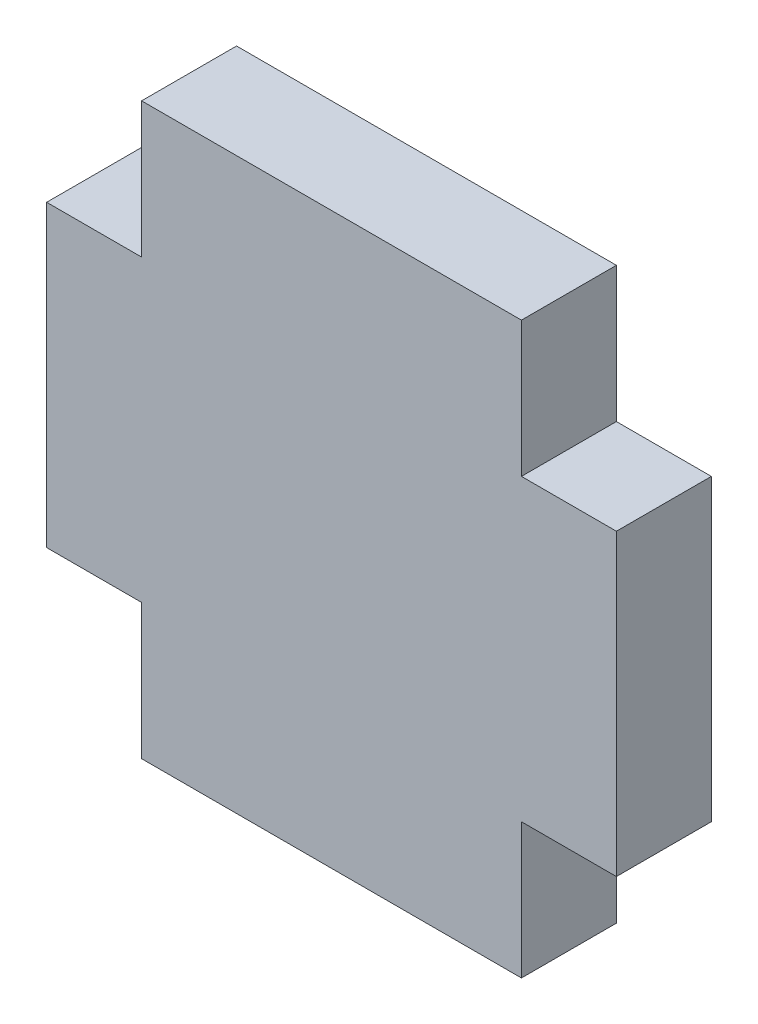
ISO-10303-21;
HEADER;
FILE_DESCRIPTION(('STEP AP214'),'2;1');
FILE_NAME('part.step','',(''),(''),'','','');
FILE_SCHEMA(('AUTOMOTIVE_DESIGN { 1 0 10303 214 1 1 1 1 }'));
ENDSEC;
DATA;
#1=APPLICATION_CONTEXT('core data for automotive mechanical design processes');
#2=APPLICATION_PROTOCOL_DEFINITION('international standard','automotive_design',2000,#1);
#3=PRODUCT_CONTEXT('',#1,'mechanical');
#4=PRODUCT('Part','Part','',(#3));
#5=PRODUCT_RELATED_PRODUCT_CATEGORY('part','',(#4));
#6=PRODUCT_DEFINITION_FORMATION('','',#4);
#7=PRODUCT_DEFINITION_CONTEXT('part definition',#1,'design');
#8=PRODUCT_DEFINITION('design','',#6,#7);
#9=PRODUCT_DEFINITION_SHAPE('','',#8);
#10=(LENGTH_UNIT() NAMED_UNIT(*) SI_UNIT(.MILLI.,.METRE.));
#11=(NAMED_UNIT(*) PLANE_ANGLE_UNIT() SI_UNIT($,.RADIAN.));
#12=(NAMED_UNIT(*) SI_UNIT($,.STERADIAN.) SOLID_ANGLE_UNIT());
#13=UNCERTAINTY_MEASURE_WITH_UNIT(LENGTH_MEASURE(1.E-05),#10,'distance_accuracy_value','');
#14=(GEOMETRIC_REPRESENTATION_CONTEXT(3) GLOBAL_UNCERTAINTY_ASSIGNED_CONTEXT((#13)) GLOBAL_UNIT_ASSIGNED_CONTEXT((#10,
#11,#12)) REPRESENTATION_CONTEXT('',''));
#15=CARTESIAN_POINT('',(0.,0.,0.));
#16=DIRECTION('',(0.,0.,1.));
#17=DIRECTION('',(1.,0.,0.));
#18=AXIS2_PLACEMENT_3D('',#15,#16,#17);
#19=CARTESIAN_POINT('',(-12.7,0.,6.35));
#20=DIRECTION('',(1.,0.,0.));
#21=DIRECTION('',(0.,0.,-1.));
#22=AXIS2_PLACEMENT_3D('',#19,#20,#21);
#23=PLANE('',#22);
#24=DIRECTION('',(0.,-1.,0.));
#25=VECTOR('',#24,1.);
#26=CARTESIAN_POINT('',(-12.7,0.,0.));
#27=LINE('',#26,#25);
#28=CARTESIAN_POINT('',(-12.7,19.05,0.));
#29=VERTEX_POINT('',#28);
#30=CARTESIAN_POINT('',(-12.7,10.,0.));
#31=VERTEX_POINT('',#30);
#32=EDGE_CURVE('E164',#29,#31,#27,.T.);
#33=ORIENTED_EDGE('',*,*,#32,.T.);
#34=DIRECTION('',(0.,0.,-1.));
#35=VECTOR('',#34,1.);
#36=CARTESIAN_POINT('',(-12.7,10.,6.35));
#37=LINE('',#36,#35);
#38=CARTESIAN_POINT('',(-12.7,10.,6.35));
#39=VERTEX_POINT('',#38);
#40=EDGE_CURVE('E11',#39,#31,#37,.T.);
#41=ORIENTED_EDGE('',*,*,#40,.F.);
#42=DIRECTION('',(0.,-1.,0.));
#43=VECTOR('',#42,1.);
#44=CARTESIAN_POINT('',(-12.7,0.,6.35));
#45=LINE('',#44,#43);
#46=CARTESIAN_POINT('',(-12.7,19.05,6.35));
#47=VERTEX_POINT('',#46);
#48=EDGE_CURVE('E107',#47,#39,#45,.T.);
#49=ORIENTED_EDGE('',*,*,#48,.F.);
#50=DIRECTION('',(0.,0.,-1.));
#51=VECTOR('',#50,1.);
#52=CARTESIAN_POINT('',(-12.7,19.05,6.35));
#53=LINE('',#52,#51);
#54=EDGE_CURVE('E58',#47,#29,#53,.T.);
#55=ORIENTED_EDGE('',*,*,#54,.T.);
#56=EDGE_LOOP('',(#33,#41,#49,#55));
#57=FACE_BOUND('',#56,.T.);
#58=ADVANCED_FACE('F41',(#57),#23,.F.);
#59=CARTESIAN_POINT('',(0.,10.,6.35));
#60=DIRECTION('',(0.,1.,0.));
#61=DIRECTION('',(0.,0.,1.));
#62=AXIS2_PLACEMENT_3D('',#59,#60,#61);
#63=PLANE('',#62);
#64=DIRECTION('',(1.,0.,0.));
#65=VECTOR('',#64,1.);
#66=CARTESIAN_POINT('',(0.,10.,0.));
#67=LINE('',#66,#65);
#68=CARTESIAN_POINT('',(-19.05,10.,0.));
#69=VERTEX_POINT('',#68);
#70=EDGE_CURVE('E167',#69,#31,#67,.T.);
#71=ORIENTED_EDGE('',*,*,#70,.F.);
#72=DIRECTION('',(0.,0.,-1.));
#73=VECTOR('',#72,1.);
#74=CARTESIAN_POINT('',(-19.05,10.,6.35));
#75=LINE('',#74,#73);
#76=CARTESIAN_POINT('',(-19.05,10.,6.35));
#77=VERTEX_POINT('',#76);
#78=EDGE_CURVE('E50',#77,#69,#75,.T.);
#79=ORIENTED_EDGE('',*,*,#78,.F.);
#80=DIRECTION('',(1.,0.,0.));
#81=VECTOR('',#80,1.);
#82=CARTESIAN_POINT('',(0.,10.,6.35));
#83=LINE('',#82,#81);
#84=EDGE_CURVE('E246',#77,#39,#83,.T.);
#85=ORIENTED_EDGE('',*,*,#84,.T.);
#86=ORIENTED_EDGE('',*,*,#40,.T.);
#87=EDGE_LOOP('',(#71,#79,#85,#86));
#88=FACE_BOUND('',#87,.T.);
#89=ADVANCED_FACE('F245',(#88),#63,.T.);
#90=CARTESIAN_POINT('',(-19.05,0.,6.35));
#91=DIRECTION('',(1.,0.,0.));
#92=DIRECTION('',(0.,0.,-1.));
#93=AXIS2_PLACEMENT_3D('',#90,#91,#92);
#94=PLANE('',#93);
#95=DIRECTION('',(0.,-1.,0.));
#96=VECTOR('',#95,1.);
#97=CARTESIAN_POINT('',(-19.05,0.,0.));
#98=LINE('',#97,#96);
#99=CARTESIAN_POINT('',(-19.05,-10.,0.));
#100=VERTEX_POINT('',#99);
#101=EDGE_CURVE('E171',#69,#100,#98,.T.);
#102=ORIENTED_EDGE('',*,*,#101,.T.);
#103=DIRECTION('',(0.,0.,-1.));
#104=VECTOR('',#103,1.);
#105=CARTESIAN_POINT('',(-19.05,-10.,6.35));
#106=LINE('',#105,#104);
#107=CARTESIAN_POINT('',(-19.05,-10.,6.35));
#108=VERTEX_POINT('',#107);
#109=EDGE_CURVE('E228',#108,#100,#106,.T.);
#110=ORIENTED_EDGE('',*,*,#109,.F.);
#111=DIRECTION('',(0.,-1.,0.));
#112=VECTOR('',#111,1.);
#113=CARTESIAN_POINT('',(-19.05,0.,6.35));
#114=LINE('',#113,#112);
#115=EDGE_CURVE('E237',#77,#108,#114,.T.);
#116=ORIENTED_EDGE('',*,*,#115,.F.);
#117=ORIENTED_EDGE('',*,*,#78,.T.);
#118=EDGE_LOOP('',(#102,#110,#116,#117));
#119=FACE_BOUND('',#118,.T.);
#120=ADVANCED_FACE('F235',(#119),#94,.F.);
#121=CARTESIAN_POINT('',(0.,-10.,6.35));
#122=DIRECTION('',(0.,1.,0.));
#123=DIRECTION('',(0.,0.,1.));
#124=AXIS2_PLACEMENT_3D('',#121,#122,#123);
#125=PLANE('',#124);
#126=DIRECTION('',(1.,0.,0.));
#127=VECTOR('',#126,1.);
#128=CARTESIAN_POINT('',(0.,-10.,0.));
#129=LINE('',#128,#127);
#130=CARTESIAN_POINT('',(-12.7,-10.,0.));
#131=VERTEX_POINT('',#130);
#132=EDGE_CURVE('E174',#100,#131,#129,.T.);
#133=ORIENTED_EDGE('',*,*,#132,.T.);
#134=DIRECTION('',(0.,0.,-1.));
#135=VECTOR('',#134,1.);
#136=CARTESIAN_POINT('',(-12.7,-10.,6.35));
#137=LINE('',#136,#135);
#138=CARTESIAN_POINT('',(-12.7,-10.,6.35));
#139=VERTEX_POINT('',#138);
#140=EDGE_CURVE('E224',#139,#131,#137,.T.);
#141=ORIENTED_EDGE('',*,*,#140,.F.);
#142=DIRECTION('',(1.,0.,0.));
#143=VECTOR('',#142,1.);
#144=CARTESIAN_POINT('',(0.,-10.,6.35));
#145=LINE('',#144,#143);
#146=EDGE_CURVE('E404',#108,#139,#145,.T.);
#147=ORIENTED_EDGE('',*,*,#146,.F.);
#148=ORIENTED_EDGE('',*,*,#109,.T.);
#149=EDGE_LOOP('',(#133,#141,#147,#148));
#150=FACE_BOUND('',#149,.T.);
#151=ADVANCED_FACE('F264',(#150),#125,.F.);
#152=CARTESIAN_POINT('',(-12.7,0.,6.35));
#153=DIRECTION('',(1.,0.,0.));
#154=DIRECTION('',(0.,0.,-1.));
#155=AXIS2_PLACEMENT_3D('',#152,#153,#154);
#156=PLANE('',#155);
#157=DIRECTION('',(0.,-1.,0.));
#158=VECTOR('',#157,1.);
#159=CARTESIAN_POINT('',(-12.7,0.,0.));
#160=LINE('',#159,#158);
#161=CARTESIAN_POINT('',(-12.7,-19.05,0.));
#162=VERTEX_POINT('',#161);
#163=EDGE_CURVE('E177',#131,#162,#160,.T.);
#164=ORIENTED_EDGE('',*,*,#163,.T.);
#165=DIRECTION('',(0.,0.,-1.));
#166=VECTOR('',#165,1.);
#167=CARTESIAN_POINT('',(-12.7,-19.05,6.35));
#168=LINE('',#167,#166);
#169=CARTESIAN_POINT('',(-12.7,-19.05,6.35));
#170=VERTEX_POINT('',#169);
#171=EDGE_CURVE('E220',#170,#162,#168,.T.);
#172=ORIENTED_EDGE('',*,*,#171,.F.);
#173=DIRECTION('',(0.,-1.,0.));
#174=VECTOR('',#173,1.);
#175=CARTESIAN_POINT('',(-12.7,0.,6.35));
#176=LINE('',#175,#174);
#177=EDGE_CURVE('E402',#139,#170,#176,.T.);
#178=ORIENTED_EDGE('',*,*,#177,.F.);
#179=ORIENTED_EDGE('',*,*,#140,.T.);
#180=EDGE_LOOP('',(#164,#172,#178,#179));
#181=FACE_BOUND('',#180,.T.);
#182=ADVANCED_FACE('F269',(#181),#156,.F.);
#183=CARTESIAN_POINT('',(0.,-19.05,6.35));
#184=DIRECTION('',(0.,1.,0.));
#185=DIRECTION('',(0.,0.,1.));
#186=AXIS2_PLACEMENT_3D('',#183,#184,#185);
#187=PLANE('',#186);
#188=DIRECTION('',(1.,0.,0.));
#189=VECTOR('',#188,1.);
#190=CARTESIAN_POINT('',(0.,-19.05,0.));
#191=LINE('',#190,#189);
#192=CARTESIAN_POINT('',(12.7,-19.05,0.));
#193=VERTEX_POINT('',#192);
#194=EDGE_CURVE('E180',#162,#193,#191,.T.);
#195=ORIENTED_EDGE('',*,*,#194,.T.);
#196=DIRECTION('',(0.,0.,-1.));
#197=VECTOR('',#196,1.);
#198=CARTESIAN_POINT('',(12.7,-19.05,6.35));
#199=LINE('',#198,#197);
#200=CARTESIAN_POINT('',(12.7,-19.05,6.35));
#201=VERTEX_POINT('',#200);
#202=EDGE_CURVE('E217',#201,#193,#199,.T.);
#203=ORIENTED_EDGE('',*,*,#202,.F.);
#204=DIRECTION('',(1.,0.,0.));
#205=VECTOR('',#204,1.);
#206=CARTESIAN_POINT('',(0.,-19.05,6.35));
#207=LINE('',#206,#205);
#208=EDGE_CURVE('E409',#170,#201,#207,.T.);
#209=ORIENTED_EDGE('',*,*,#208,.F.);
#210=ORIENTED_EDGE('',*,*,#171,.T.);
#211=EDGE_LOOP('',(#195,#203,#209,#210));
#212=FACE_BOUND('',#211,.T.);
#213=ADVANCED_FACE('F273',(#212),#187,.F.);
#214=CARTESIAN_POINT('',(12.7,0.,6.35));
#215=DIRECTION('',(1.,0.,0.));
#216=DIRECTION('',(0.,0.,-1.));
#217=AXIS2_PLACEMENT_3D('',#214,#215,#216);
#218=PLANE('',#217);
#219=DIRECTION('',(0.,-1.,0.));
#220=VECTOR('',#219,1.);
#221=CARTESIAN_POINT('',(12.7,0.,0.));
#222=LINE('',#221,#220);
#223=CARTESIAN_POINT('',(12.7,-10.,0.));
#224=VERTEX_POINT('',#223);
#225=EDGE_CURVE('E184',#224,#193,#222,.T.);
#226=ORIENTED_EDGE('',*,*,#225,.F.);
#227=DIRECTION('',(0.,0.,-1.));
#228=VECTOR('',#227,1.);
#229=CARTESIAN_POINT('',(12.7,-10.,6.35));
#230=LINE('',#229,#228);
#231=CARTESIAN_POINT('',(12.7,-10.,6.35));
#232=VERTEX_POINT('',#231);
#233=EDGE_CURVE('E214',#232,#224,#230,.T.);
#234=ORIENTED_EDGE('',*,*,#233,.F.);
#235=DIRECTION('',(0.,-1.,0.));
#236=VECTOR('',#235,1.);
#237=CARTESIAN_POINT('',(12.7,0.,6.35));
#238=LINE('',#237,#236);
#239=EDGE_CURVE('E397',#232,#201,#238,.T.);
#240=ORIENTED_EDGE('',*,*,#239,.T.);
#241=ORIENTED_EDGE('',*,*,#202,.T.);
#242=EDGE_LOOP('',(#226,#234,#240,#241));
#243=FACE_BOUND('',#242,.T.);
#244=ADVANCED_FACE('F277',(#243),#218,.T.);
#245=CARTESIAN_POINT('',(0.,-10.,6.35));
#246=DIRECTION('',(0.,1.,0.));
#247=DIRECTION('',(0.,0.,1.));
#248=AXIS2_PLACEMENT_3D('',#245,#246,#247);
#249=PLANE('',#248);
#250=DIRECTION('',(1.,0.,0.));
#251=VECTOR('',#250,1.);
#252=CARTESIAN_POINT('',(0.,-10.,0.));
#253=LINE('',#252,#251);
#254=CARTESIAN_POINT('',(19.05,-10.,0.));
#255=VERTEX_POINT('',#254);
#256=EDGE_CURVE('E188',#224,#255,#253,.T.);
#257=ORIENTED_EDGE('',*,*,#256,.T.);
#258=DIRECTION('',(0.,0.,-1.));
#259=VECTOR('',#258,1.);
#260=CARTESIAN_POINT('',(19.05,-10.,6.35));
#261=LINE('',#260,#259);
#262=CARTESIAN_POINT('',(19.05,-10.,6.35));
#263=VERTEX_POINT('',#262);
#264=EDGE_CURVE('E211',#263,#255,#261,.T.);
#265=ORIENTED_EDGE('',*,*,#264,.F.);
#266=DIRECTION('',(1.,0.,0.));
#267=VECTOR('',#266,1.);
#268=CARTESIAN_POINT('',(0.,-10.,6.35));
#269=LINE('',#268,#267);
#270=EDGE_CURVE('E418',#232,#263,#269,.T.);
#271=ORIENTED_EDGE('',*,*,#270,.F.);
#272=ORIENTED_EDGE('',*,*,#233,.T.);
#273=EDGE_LOOP('',(#257,#265,#271,#272));
#274=FACE_BOUND('',#273,.T.);
#275=ADVANCED_FACE('F281',(#274),#249,.F.);
#276=CARTESIAN_POINT('',(19.05,0.,6.35));
#277=DIRECTION('',(1.,0.,0.));
#278=DIRECTION('',(0.,0.,-1.));
#279=AXIS2_PLACEMENT_3D('',#276,#277,#278);
#280=PLANE('',#279);
#281=DIRECTION('',(0.,-1.,0.));
#282=VECTOR('',#281,1.);
#283=CARTESIAN_POINT('',(19.05,0.,0.));
#284=LINE('',#283,#282);
#285=CARTESIAN_POINT('',(19.05,10.,0.));
#286=VERTEX_POINT('',#285);
#287=EDGE_CURVE('E192',#286,#255,#284,.T.);
#288=ORIENTED_EDGE('',*,*,#287,.F.);
#289=DIRECTION('',(0.,0.,-1.));
#290=VECTOR('',#289,1.);
#291=CARTESIAN_POINT('',(19.05,10.,6.35));
#292=LINE('',#291,#290);
#293=CARTESIAN_POINT('',(19.05,10.,6.35));
#294=VERTEX_POINT('',#293);
#295=EDGE_CURVE('E146',#294,#286,#292,.T.);
#296=ORIENTED_EDGE('',*,*,#295,.F.);
#297=DIRECTION('',(0.,-1.,0.));
#298=VECTOR('',#297,1.);
#299=CARTESIAN_POINT('',(19.05,0.,6.35));
#300=LINE('',#299,#298);
#301=EDGE_CURVE('E153',#294,#263,#300,.T.);
#302=ORIENTED_EDGE('',*,*,#301,.T.);
#303=ORIENTED_EDGE('',*,*,#264,.T.);
#304=EDGE_LOOP('',(#288,#296,#302,#303));
#305=FACE_BOUND('',#304,.T.);
#306=ADVANCED_FACE('F285',(#305),#280,.T.);
#307=CARTESIAN_POINT('',(0.,10.,6.35));
#308=DIRECTION('',(0.,1.,0.));
#309=DIRECTION('',(0.,0.,1.));
#310=AXIS2_PLACEMENT_3D('',#307,#308,#309);
#311=PLANE('',#310);
#312=DIRECTION('',(1.,0.,0.));
#313=VECTOR('',#312,1.);
#314=CARTESIAN_POINT('',(0.,10.,0.));
#315=LINE('',#314,#313);
#316=CARTESIAN_POINT('',(12.7,10.,0.));
#317=VERTEX_POINT('',#316);
#318=EDGE_CURVE('E141',#317,#286,#315,.T.);
#319=ORIENTED_EDGE('',*,*,#318,.F.);
#320=DIRECTION('',(0.,0.,-1.));
#321=VECTOR('',#320,1.);
#322=CARTESIAN_POINT('',(12.7,10.,6.35));
#323=LINE('',#322,#321);
#324=CARTESIAN_POINT('',(12.7,10.,6.35));
#325=VERTEX_POINT('',#324);
#326=EDGE_CURVE('E136',#325,#317,#323,.T.);
#327=ORIENTED_EDGE('',*,*,#326,.F.);
#328=DIRECTION('',(1.,0.,0.));
#329=VECTOR('',#328,1.);
#330=CARTESIAN_POINT('',(0.,10.,6.35));
#331=LINE('',#330,#329);
#332=EDGE_CURVE('E139',#325,#294,#331,.T.);
#333=ORIENTED_EDGE('',*,*,#332,.T.);
#334=ORIENTED_EDGE('',*,*,#295,.T.);
#335=EDGE_LOOP('',(#319,#327,#333,#334));
#336=FACE_BOUND('',#335,.T.);
#337=ADVANCED_FACE('F138',(#336),#311,.T.);
#338=CARTESIAN_POINT('',(12.7,0.,6.35));
#339=DIRECTION('',(1.,0.,0.));
#340=DIRECTION('',(0.,0.,-1.));
#341=AXIS2_PLACEMENT_3D('',#338,#339,#340);
#342=PLANE('',#341);
#343=DIRECTION('',(0.,-1.,0.));
#344=VECTOR('',#343,1.);
#345=CARTESIAN_POINT('',(12.7,0.,0.));
#346=LINE('',#345,#344);
#347=CARTESIAN_POINT('',(12.7,19.05,0.));
#348=VERTEX_POINT('',#347);
#349=EDGE_CURVE('E198',#348,#317,#346,.T.);
#350=ORIENTED_EDGE('',*,*,#349,.F.);
#351=DIRECTION('',(0.,0.,-1.));
#352=VECTOR('',#351,1.);
#353=CARTESIAN_POINT('',(12.7,19.05,6.35));
#354=LINE('',#353,#352);
#355=CARTESIAN_POINT('',(12.7,19.05,6.35));
#356=VERTEX_POINT('',#355);
#357=EDGE_CURVE('E95',#356,#348,#354,.T.);
#358=ORIENTED_EDGE('',*,*,#357,.F.);
#359=DIRECTION('',(0.,-1.,0.));
#360=VECTOR('',#359,1.);
#361=CARTESIAN_POINT('',(12.7,0.,6.35));
#362=LINE('',#361,#360);
#363=EDGE_CURVE('E151',#356,#325,#362,.T.);
#364=ORIENTED_EDGE('',*,*,#363,.T.);
#365=ORIENTED_EDGE('',*,*,#326,.T.);
#366=EDGE_LOOP('',(#350,#358,#364,#365));
#367=FACE_BOUND('',#366,.T.);
#368=ADVANCED_FACE('F156',(#367),#342,.T.);
#369=CARTESIAN_POINT('',(0.,19.05,6.35));
#370=DIRECTION('',(0.,1.,0.));
#371=DIRECTION('',(0.,0.,1.));
#372=AXIS2_PLACEMENT_3D('',#369,#370,#371);
#373=PLANE('',#372);
#374=DIRECTION('',(1.,0.,0.));
#375=VECTOR('',#374,1.);
#376=CARTESIAN_POINT('',(0.,19.05,0.));
#377=LINE('',#376,#375);
#378=EDGE_CURVE('E201',#29,#348,#377,.T.);
#379=ORIENTED_EDGE('',*,*,#378,.F.);
#380=ORIENTED_EDGE('',*,*,#54,.F.);
#381=DIRECTION('',(1.,0.,0.));
#382=VECTOR('',#381,1.);
#383=CARTESIAN_POINT('',(0.,19.05,6.35));
#384=LINE('',#383,#382);
#385=EDGE_CURVE('E158',#47,#356,#384,.T.);
#386=ORIENTED_EDGE('',*,*,#385,.T.);
#387=ORIENTED_EDGE('',*,*,#357,.T.);
#388=EDGE_LOOP('',(#379,#380,#386,#387));
#389=FACE_BOUND('',#388,.T.);
#390=ADVANCED_FACE('F247',(#389),#373,.T.);
#391=CARTESIAN_POINT('',(0.,0.,6.35));
#392=DIRECTION('',(0.,0.,1.));
#393=DIRECTION('',(1.,0.,0.));
#394=AXIS2_PLACEMENT_3D('',#391,#392,#393);
#395=PLANE('',#394);
#396=ORIENTED_EDGE('',*,*,#48,.T.);
#397=ORIENTED_EDGE('',*,*,#84,.F.);
#398=ORIENTED_EDGE('',*,*,#115,.T.);
#399=ORIENTED_EDGE('',*,*,#146,.T.);
#400=ORIENTED_EDGE('',*,*,#177,.T.);
#401=ORIENTED_EDGE('',*,*,#208,.T.);
#402=ORIENTED_EDGE('',*,*,#239,.F.);
#403=ORIENTED_EDGE('',*,*,#270,.T.);
#404=ORIENTED_EDGE('',*,*,#301,.F.);
#405=ORIENTED_EDGE('',*,*,#332,.F.);
#406=ORIENTED_EDGE('',*,*,#363,.F.);
#407=ORIENTED_EDGE('',*,*,#385,.F.);
#408=EDGE_LOOP('',(#396,#397,#398,#399,#400,#401,#402,#403,#404,#405,#406,#407));
#409=FACE_BOUND('',#408,.T.);
#410=ADVANCED_FACE('F150',(#409),#395,.T.);
#411=CARTESIAN_POINT('',(0.,0.,0.));
#412=DIRECTION('',(0.,0.,1.));
#413=DIRECTION('',(1.,0.,0.));
#414=AXIS2_PLACEMENT_3D('',#411,#412,#413);
#415=PLANE('',#414);
#416=ORIENTED_EDGE('',*,*,#32,.F.);
#417=ORIENTED_EDGE('',*,*,#378,.T.);
#418=ORIENTED_EDGE('',*,*,#349,.T.);
#419=ORIENTED_EDGE('',*,*,#318,.T.);
#420=ORIENTED_EDGE('',*,*,#287,.T.);
#421=ORIENTED_EDGE('',*,*,#256,.F.);
#422=ORIENTED_EDGE('',*,*,#225,.T.);
#423=ORIENTED_EDGE('',*,*,#194,.F.);
#424=ORIENTED_EDGE('',*,*,#163,.F.);
#425=ORIENTED_EDGE('',*,*,#132,.F.);
#426=ORIENTED_EDGE('',*,*,#101,.F.);
#427=ORIENTED_EDGE('',*,*,#70,.T.);
#428=EDGE_LOOP('',(#416,#417,#418,#419,#420,#421,#422,#423,#424,#425,#426,#427));
#429=FACE_BOUND('',#428,.T.);
#430=ADVANCED_FACE('F243',(#429),#415,.F.);
#431=CLOSED_SHELL('',(#58,#89,#120,#151,#182,#213,#244,#275,#306,#337,#368,#390,#410,#430));
#432=MANIFOLD_SOLID_BREP('B2',#431);
#433=ADVANCED_BREP_SHAPE_REPRESENTATION('',(#18,#432),#14);
#434=SHAPE_DEFINITION_REPRESENTATION(#9,#433);
ENDSEC;
END-ISO-10303-21;
